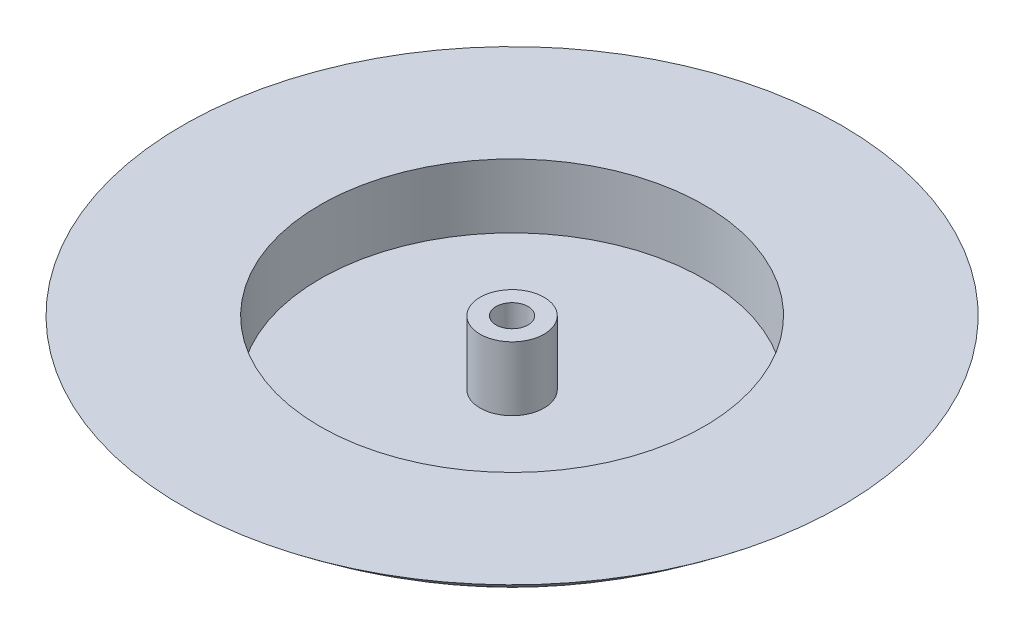
ISO-10303-21;
HEADER;
FILE_DESCRIPTION(('STEP AP214'),'2;1');
FILE_NAME('part.step','',(''),(''),'','','');
FILE_SCHEMA(('AUTOMOTIVE_DESIGN { 1 0 10303 214 1 1 1 1 }'));
ENDSEC;
DATA;
#1=APPLICATION_CONTEXT('core data for automotive mechanical design processes');
#2=APPLICATION_PROTOCOL_DEFINITION('international standard','automotive_design',2000,#1);
#3=PRODUCT_CONTEXT('',#1,'mechanical');
#4=PRODUCT('Part','Part','',(#3));
#5=PRODUCT_RELATED_PRODUCT_CATEGORY('part','',(#4));
#6=PRODUCT_DEFINITION_FORMATION('','',#4);
#7=PRODUCT_DEFINITION_CONTEXT('part definition',#1,'design');
#8=PRODUCT_DEFINITION('design','',#6,#7);
#9=PRODUCT_DEFINITION_SHAPE('','',#8);
#10=(LENGTH_UNIT() NAMED_UNIT(*) SI_UNIT(.MILLI.,.METRE.));
#11=(NAMED_UNIT(*) PLANE_ANGLE_UNIT() SI_UNIT($,.RADIAN.));
#12=(NAMED_UNIT(*) SI_UNIT($,.STERADIAN.) SOLID_ANGLE_UNIT());
#13=UNCERTAINTY_MEASURE_WITH_UNIT(LENGTH_MEASURE(1.E-05),#10,'distance_accuracy_value','');
#14=(GEOMETRIC_REPRESENTATION_CONTEXT(3) GLOBAL_UNCERTAINTY_ASSIGNED_CONTEXT((#13)) GLOBAL_UNIT_ASSIGNED_CONTEXT((#10,
#11,#12)) REPRESENTATION_CONTEXT('',''));
#15=CARTESIAN_POINT('',(0.,0.,0.));
#16=DIRECTION('',(0.,0.,1.));
#17=DIRECTION('',(1.,0.,0.));
#18=AXIS2_PLACEMENT_3D('',#15,#16,#17);
#19=CARTESIAN_POINT('',(0.,26.4816555898692,-51.5));
#20=DIRECTION('',(0.,1.,0.));
#21=DIRECTION('',(0.,0.,1.));
#22=AXIS2_PLACEMENT_3D('',#19,#20,#21);
#23=PLANE('',#22);
#24=CARTESIAN_POINT('',(0.,26.4816555898692,0.));
#25=DIRECTION('',(0.,1.,0.));
#26=DIRECTION('',(0.,0.,1.));
#27=AXIS2_PLACEMENT_3D('',#24,#25,#26);
#28=CIRCLE('',#27,30.);
#29=CARTESIAN_POINT('',(0.,26.4816555898692,30.));
#30=VERTEX_POINT('',#29);
#31=EDGE_CURVE('E81',#30,#30,#28,.T.);
#32=ORIENTED_EDGE('',*,*,#31,.F.);
#33=EDGE_LOOP('',(#32));
#34=FACE_BOUND('',#33,.T.);
#35=CARTESIAN_POINT('',(0.,26.4816555898693,0.));
#36=DIRECTION('',(0.,-1.,0.));
#37=DIRECTION('',(0.,0.,-1.));
#38=AXIS2_PLACEMENT_3D('',#35,#36,#37);
#39=CIRCLE('',#38,51.5);
#40=CARTESIAN_POINT('',(0.,26.4816555898692,-51.5));
#41=VERTEX_POINT('',#40);
#42=EDGE_CURVE('E11',#41,#41,#39,.T.);
#43=ORIENTED_EDGE('',*,*,#42,.F.);
#44=EDGE_LOOP('',(#43));
#45=FACE_BOUND('',#44,.T.);
#46=ADVANCED_FACE('F42',(#34,#45),#23,.T.);
#47=CARTESIAN_POINT('',(0.,0.,0.));
#48=CARTESIAN_POINT('',(0.,0.0413319301954705,-0.156539895280527));
#49=CARTESIAN_POINT('',(0.,0.124531454612048,-0.469530075515326));
#50=CARTESIAN_POINT('',(0.,0.293183386105284,-1.09551166944429));
#51=CARTESIAN_POINT('',(0.,0.508331121474382,-1.87355495060607));
#52=CARTESIAN_POINT('',(0.,0.728374070174588,-2.64912335099349));
#53=CARTESIAN_POINT('',(0.,0.953638070904202,-3.42341225179432));
#54=CARTESIAN_POINT('',(0.,1.12826698384568,-4.01373387869465));
#55=CARTESIAN_POINT('',(0.,1.37969422050258,-4.84491261069241));
#56=CARTESIAN_POINT('',(0.,1.52567138315617,-5.31784246485265));
#57=CARTESIAN_POINT('',(0.,1.89872856329887,-6.50927685202446));
#58=CARTESIAN_POINT('',(0.,2.14003406561604,-7.24332705341738));
#59=CARTESIAN_POINT('',(0.,2.4905671589551,-8.30720756157791));
#60=CARTESIAN_POINT('',(0.,2.79074901707134,-9.18117529105278));
#61=CARTESIAN_POINT('',(0.,3.21240817627402,-10.3925120935596));
#62=CARTESIAN_POINT('',(0.,3.6256181986127,-11.5332411771859));
#63=CARTESIAN_POINT('',(0.,4.06430732355743,-12.7139805032321));
#64=CARTESIAN_POINT('',(0.,4.50673070128452,-13.8640307886929));
#65=CARTESIAN_POINT('',(0.,4.87135482413426,-14.7932377876446));
#66=CARTESIAN_POINT('',(0.,5.33337723436768,-15.943087068115));
#67=CARTESIAN_POINT('',(0.,5.90311204993719,-17.3217906778708));
#68=CARTESIAN_POINT('',(0.,6.58710508642851,-18.9190587097541));
#69=CARTESIAN_POINT('',(0.,7.39658143117068,-20.7342536847658));
#70=CARTESIAN_POINT('',(0.,8.23275850260507,-22.5363401807281));
#71=CARTESIAN_POINT('',(0.,9.09555613838352,-24.3262939048498));
#72=CARTESIAN_POINT('',(0.,9.98455615309638,-26.1032697466904));
#73=CARTESIAN_POINT('',(0.,10.8991030734356,-27.8670202135578));
#74=CARTESIAN_POINT('',(0.,11.8393142258399,-29.6178019345704));
#75=CARTESIAN_POINT('',(0.,12.9428136237317,-31.6046184203034));
#76=CARTESIAN_POINT('',(0.,14.080801884258,-33.5741356159205));
#77=CARTESIAN_POINT('',(0.,15.2490618589972,-35.5218192135613));
#78=CARTESIAN_POINT('',(0.,16.4525056129004,-37.454629603444));
#79=CARTESIAN_POINT('',(0.,17.5215092133771,-39.1226885350467));
#80=CARTESIAN_POINT('',(0.,18.8966585694979,-41.2037749144908));
#81=CARTESIAN_POINT('',(0.,20.2890196995726,-43.2368448050951));
#82=CARTESIAN_POINT('',(0.,21.7481371008506,-45.2856619092949));
#83=CARTESIAN_POINT('',(0.,23.1921768285945,-47.24872340085));
#84=CARTESIAN_POINT('',(0.,24.2908741970742,-48.6989430504591));
#85=CARTESIAN_POINT('',(0.,25.1112638462573,-49.7649773946986));
#86=CARTESIAN_POINT('',(0.,25.9373551214606,-50.8153259105643));
#87=CARTESIAN_POINT('',(0.,26.2264591235433,-51.1802811480443));
#88=CARTESIAN_POINT('',(0.,26.4191445789267,-51.4217910873791));
#89=CARTESIAN_POINT('',(0.,26.4816555898709,-51.5000000000021));
#90=B_SPLINE_CURVE_WITH_KNOTS('',4,(#47,#48,#49,#50,#51,#52,#53,#54,#55,#56,#57,#58,#59,#60,#61,
#62,#63,#64,#65,#66,#67,#68,#69,#70,#71,#72,#73,#74,#75,#76,#77,#78,#79,#80,#81,#82,#83,#84,#85,
#86,#87,#88,#89),.UNSPECIFIED.,.F.,.F.,(5,1,1,1,1,1,1,1,1,1,1,1,1,1,1,1,1,1,1,1,1,1,1,1,1,1,1,1,
1,1,1,1,1,1,1,1,1,1,1,5),(0.,0.010253590910387,0.0205071818207739,0.0410143636415478,
0.0511421429400787,0.0612699222386097,0.0713977015371406,0.0815254808356715,0.0972474942165886,
0.112969507597506,0.128691521048981,0.144413534500456,0.160135548048904,0.175857561597351,
0.207301586094038,0.22302360104625,0.238745615998462,0.254467628551395,0.270189641104327,
0.301633667131901,0.333077697559079,0.364521719130124,0.39596575239303,0.427409778554093,
0.458853798725071,0.490297837236467,0.521741856072637,0.55318588172206,0.602761530362306,
0.634205557742097,0.665649585121888,0.697093612834568,0.728537640547248,0.791425689407033,
0.822869716434879,0.854313743462725,0.885757776937445,0.901479793674805,0.917201810412165,
0.924236329709866),.UNSPECIFIED.);
#91=CARTESIAN_POINT('',(0.,0.,0.));
#92=DIRECTION('',(0.,-1.,0.));
#93=AXIS1_PLACEMENT('',#91,#92);
#94=SURFACE_OF_REVOLUTION('',#90,#93);
#95=ORIENTED_EDGE('',*,*,#42,.T.);
#96=EDGE_LOOP('',(#95));
#97=FACE_BOUND('',#96,.T.);
#98=CARTESIAN_POINT('',(0.,0.,0.));
#99=VERTEX_POINT('',#98);
#100=VERTEX_LOOP('',#99);
#101=FACE_BOUND('',#100,.T.);
#102=ADVANCED_FACE('F94',(#97,#101),#94,.F.);
#103=CARTESIAN_POINT('',(0.,16.4816555898692,0.));
#104=DIRECTION('',(0.,1.,0.));
#105=DIRECTION('',(0.,0.,1.));
#106=AXIS2_PLACEMENT_3D('',#103,#104,#105);
#107=CYLINDRICAL_SURFACE('',#106,30.);
#108=CARTESIAN_POINT('',(0.,16.4816555898692,0.));
#109=DIRECTION('',(0.,1.,0.));
#110=DIRECTION('',(0.,0.,1.));
#111=AXIS2_PLACEMENT_3D('',#108,#109,#110);
#112=CIRCLE('',#111,30.);
#113=CARTESIAN_POINT('',(0.,16.4816555898692,30.));
#114=VERTEX_POINT('',#113);
#115=EDGE_CURVE('E50',#114,#114,#112,.T.);
#116=ORIENTED_EDGE('',*,*,#115,.F.);
#117=EDGE_LOOP('',(#116));
#118=FACE_BOUND('',#117,.T.);
#119=ORIENTED_EDGE('',*,*,#31,.T.);
#120=EDGE_LOOP('',(#119));
#121=FACE_BOUND('',#120,.T.);
#122=ADVANCED_FACE('F97',(#118,#121),#107,.F.);
#123=CARTESIAN_POINT('',(0.,16.4816555898692,0.));
#124=DIRECTION('',(0.,1.,0.));
#125=DIRECTION('',(0.,0.,1.));
#126=AXIS2_PLACEMENT_3D('',#123,#124,#125);
#127=PLANE('',#126);
#128=CARTESIAN_POINT('',(0.,16.4816555898692,0.));
#129=DIRECTION('',(0.,1.,0.));
#130=DIRECTION('',(0.,0.,1.));
#131=AXIS2_PLACEMENT_3D('',#128,#129,#130);
#132=CIRCLE('',#131,5.);
#133=CARTESIAN_POINT('',(0.,16.4816555898692,4.99999999999997));
#134=VERTEX_POINT('',#133);
#135=EDGE_CURVE('E74',#134,#134,#132,.T.);
#136=ORIENTED_EDGE('',*,*,#135,.F.);
#137=EDGE_LOOP('',(#136));
#138=FACE_BOUND('',#137,.T.);
#139=ORIENTED_EDGE('',*,*,#115,.T.);
#140=EDGE_LOOP('',(#139));
#141=FACE_BOUND('',#140,.T.);
#142=ADVANCED_FACE('F101',(#138,#141),#127,.T.);
#143=CARTESIAN_POINT('',(0.,16.4816555898692,0.));
#144=DIRECTION('',(0.,1.,0.));
#145=DIRECTION('',(0.,0.,1.));
#146=AXIS2_PLACEMENT_3D('',#143,#144,#145);
#147=CYLINDRICAL_SURFACE('',#146,5.);
#148=ORIENTED_EDGE('',*,*,#135,.T.);
#149=EDGE_LOOP('',(#148));
#150=FACE_BOUND('',#149,.T.);
#151=CARTESIAN_POINT('',(0.,26.4816555898692,0.));
#152=DIRECTION('',(0.,1.,0.));
#153=DIRECTION('',(0.,0.,1.));
#154=AXIS2_PLACEMENT_3D('',#151,#152,#153);
#155=CIRCLE('',#154,5.);
#156=CARTESIAN_POINT('',(0.,26.4816555898692,4.99999999999997));
#157=VERTEX_POINT('',#156);
#158=EDGE_CURVE('E67',#157,#157,#155,.T.);
#159=ORIENTED_EDGE('',*,*,#158,.F.);
#160=EDGE_LOOP('',(#159));
#161=FACE_BOUND('',#160,.T.);
#162=ADVANCED_FACE('F105',(#150,#161),#147,.T.);
#163=CARTESIAN_POINT('',(0.,26.4816555898692,0.));
#164=DIRECTION('',(0.,1.,0.));
#165=DIRECTION('',(0.,0.,1.));
#166=AXIS2_PLACEMENT_3D('',#163,#164,#165);
#167=CIRCLE('',#166,2.49999999999999);
#168=CARTESIAN_POINT('',(0.,26.4816555898692,2.49999999999996));
#169=VERTEX_POINT('',#168);
#170=EDGE_CURVE('E68',#169,#169,#167,.T.);
#171=ORIENTED_EDGE('',*,*,#170,.F.);
#172=EDGE_LOOP('',(#171));
#173=FACE_BOUND('',#172,.T.);
#174=ORIENTED_EDGE('',*,*,#158,.T.);
#175=EDGE_LOOP('',(#174));
#176=FACE_BOUND('',#175,.T.);
#177=ADVANCED_FACE('F60',(#173,#176),#23,.T.);
#178=CARTESIAN_POINT('',(0.,7.98380713743813,0.));
#179=DIRECTION('',(0.,1.,0.));
#180=DIRECTION('',(0.,0.,1.));
#181=AXIS2_PLACEMENT_3D('',#178,#179,#180);
#182=CONICAL_SURFACE('',#181,2.5,1.02974425867665);
#183=CARTESIAN_POINT('',(0.,6.48165558986923,0.));
#184=VERTEX_POINT('',#183);
#185=VERTEX_LOOP('',#184);
#186=FACE_BOUND('',#185,.T.);
#187=CARTESIAN_POINT('',(0.,7.98380713743813,0.));
#188=DIRECTION('',(0.,1.,0.));
#189=DIRECTION('',(0.,0.,1.));
#190=AXIS2_PLACEMENT_3D('',#187,#188,#189);
#191=CIRCLE('',#190,2.5);
#192=CARTESIAN_POINT('',(0.,7.98380713743813,2.49999999999997));
#193=VERTEX_POINT('',#192);
#194=EDGE_CURVE('E64',#193,#193,#191,.T.);
#195=ORIENTED_EDGE('',*,*,#194,.T.);
#196=EDGE_LOOP('',(#195));
#197=FACE_BOUND('',#196,.T.);
#198=ADVANCED_FACE('F56',(#186,#197),#182,.F.);
#199=CARTESIAN_POINT('',(0.,26.4816555898692,0.));
#200=DIRECTION('',(0.,1.,0.));
#201=DIRECTION('',(0.,0.,1.));
#202=AXIS2_PLACEMENT_3D('',#199,#200,#201);
#203=CYLINDRICAL_SURFACE('',#202,2.49999999999999);
#204=ORIENTED_EDGE('',*,*,#194,.F.);
#205=EDGE_LOOP('',(#204));
#206=FACE_BOUND('',#205,.T.);
#207=ORIENTED_EDGE('',*,*,#170,.T.);
#208=EDGE_LOOP('',(#207));
#209=FACE_BOUND('',#208,.T.);
#210=ADVANCED_FACE('F59',(#206,#209),#203,.F.);
#211=CLOSED_SHELL('',(#46,#102,#122,#142,#162,#177,#198,#210));
#212=MANIFOLD_SOLID_BREP('B2',#211);
#213=ADVANCED_BREP_SHAPE_REPRESENTATION('',(#18,#212),#14);
#214=SHAPE_DEFINITION_REPRESENTATION(#9,#213);
ENDSEC;
END-ISO-10303-21;
